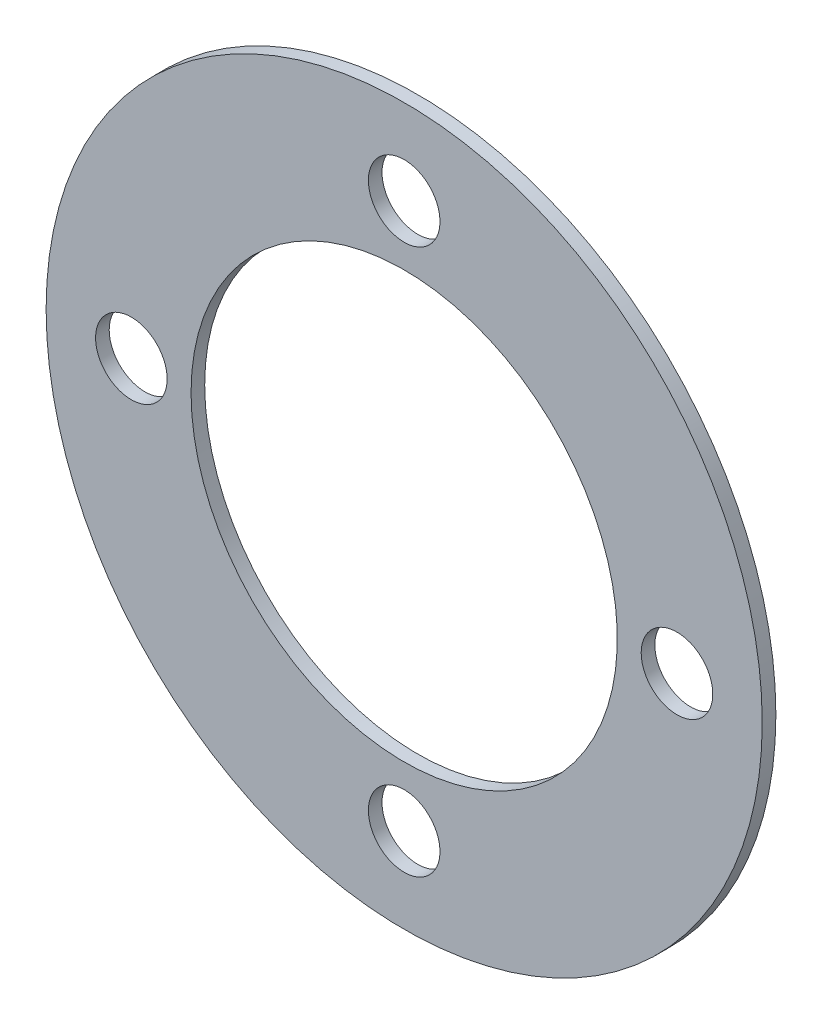
ISO-10303-21;
HEADER;
FILE_DESCRIPTION(('STEP AP214'),'2;1');
FILE_NAME('part.step','',(''),(''),'','','');
FILE_SCHEMA(('AUTOMOTIVE_DESIGN { 1 0 10303 214 1 1 1 1 }'));
ENDSEC;
DATA;
#1=APPLICATION_CONTEXT('core data for automotive mechanical design processes');
#2=APPLICATION_PROTOCOL_DEFINITION('international standard','automotive_design',2000,#1);
#3=PRODUCT_CONTEXT('',#1,'mechanical');
#4=PRODUCT('Part','Part','',(#3));
#5=PRODUCT_RELATED_PRODUCT_CATEGORY('part','',(#4));
#6=PRODUCT_DEFINITION_FORMATION('','',#4);
#7=PRODUCT_DEFINITION_CONTEXT('part definition',#1,'design');
#8=PRODUCT_DEFINITION('design','',#6,#7);
#9=PRODUCT_DEFINITION_SHAPE('','',#8);
#10=(LENGTH_UNIT() NAMED_UNIT(*) SI_UNIT(.MILLI.,.METRE.));
#11=(NAMED_UNIT(*) PLANE_ANGLE_UNIT() SI_UNIT($,.RADIAN.));
#12=(NAMED_UNIT(*) SI_UNIT($,.STERADIAN.) SOLID_ANGLE_UNIT());
#13=UNCERTAINTY_MEASURE_WITH_UNIT(LENGTH_MEASURE(1.E-05),#10,'distance_accuracy_value','');
#14=(GEOMETRIC_REPRESENTATION_CONTEXT(3) GLOBAL_UNCERTAINTY_ASSIGNED_CONTEXT((#13)) GLOBAL_UNIT_ASSIGNED_CONTEXT((#10,
#11,#12)) REPRESENTATION_CONTEXT('',''));
#15=CARTESIAN_POINT('',(0.,0.,0.));
#16=DIRECTION('',(0.,0.,1.));
#17=DIRECTION('',(1.,0.,0.));
#18=AXIS2_PLACEMENT_3D('',#15,#16,#17);
#19=CARTESIAN_POINT('',(0.,0.,0.));
#20=DIRECTION('',(0.,0.,1.));
#21=DIRECTION('',(1.,0.,0.));
#22=AXIS2_PLACEMENT_3D('',#19,#20,#21);
#23=PLANE('',#22);
#24=CARTESIAN_POINT('',(-16.,0.,0.));
#25=DIRECTION('',(0.,0.,-1.));
#26=DIRECTION('',(-1.,0.,0.));
#27=AXIS2_PLACEMENT_3D('',#24,#25,#26);
#28=CIRCLE('',#27,2.1);
#29=CARTESIAN_POINT('',(-18.1,0.,0.));
#30=VERTEX_POINT('',#29);
#31=EDGE_CURVE('E41',#30,#30,#28,.F.);
#32=ORIENTED_EDGE('',*,*,#31,.T.);
#33=EDGE_LOOP('',(#32));
#34=FACE_BOUND('',#33,.T.);
#35=CARTESIAN_POINT('',(16.,0.,0.));
#36=DIRECTION('',(0.,0.,-1.));
#37=DIRECTION('',(-1.,0.,0.));
#38=AXIS2_PLACEMENT_3D('',#35,#36,#37);
#39=CIRCLE('',#38,2.1);
#40=CARTESIAN_POINT('',(13.9,0.,0.));
#41=VERTEX_POINT('',#40);
#42=EDGE_CURVE('E44',#41,#41,#39,.F.);
#43=ORIENTED_EDGE('',*,*,#42,.T.);
#44=EDGE_LOOP('',(#43));
#45=FACE_BOUND('',#44,.T.);
#46=CARTESIAN_POINT('',(0.,0.,0.));
#47=DIRECTION('',(0.,0.,-1.));
#48=DIRECTION('',(-1.,0.,0.));
#49=AXIS2_PLACEMENT_3D('',#46,#47,#48);
#50=CIRCLE('',#49,12.5);
#51=CARTESIAN_POINT('',(-12.5,0.,0.));
#52=VERTEX_POINT('',#51);
#53=EDGE_CURVE('E47',#52,#52,#50,.F.);
#54=ORIENTED_EDGE('',*,*,#53,.T.);
#55=EDGE_LOOP('',(#54));
#56=FACE_BOUND('',#55,.T.);
#57=CARTESIAN_POINT('',(0.,0.,0.));
#58=DIRECTION('',(0.,0.,-1.));
#59=DIRECTION('',(-1.,0.,0.));
#60=AXIS2_PLACEMENT_3D('',#57,#58,#59);
#61=CIRCLE('',#60,21.);
#62=CARTESIAN_POINT('',(-21.,0.,0.));
#63=VERTEX_POINT('',#62);
#64=EDGE_CURVE('E50',#63,#63,#61,.F.);
#65=ORIENTED_EDGE('',*,*,#64,.F.);
#66=EDGE_LOOP('',(#65));
#67=FACE_BOUND('',#66,.T.);
#68=CARTESIAN_POINT('',(0.,16.,0.));
#69=DIRECTION('',(0.,0.,-1.));
#70=DIRECTION('',(-1.,0.,0.));
#71=AXIS2_PLACEMENT_3D('',#68,#69,#70);
#72=CIRCLE('',#71,2.1);
#73=CARTESIAN_POINT('',(-2.1,16.,0.));
#74=VERTEX_POINT('',#73);
#75=EDGE_CURVE('E52',#74,#74,#72,.F.);
#76=ORIENTED_EDGE('',*,*,#75,.T.);
#77=EDGE_LOOP('',(#76));
#78=FACE_BOUND('',#77,.T.);
#79=CARTESIAN_POINT('',(0.,-16.,0.));
#80=DIRECTION('',(0.,0.,-1.));
#81=DIRECTION('',(-1.,0.,0.));
#82=AXIS2_PLACEMENT_3D('',#79,#80,#81);
#83=CIRCLE('',#82,2.1);
#84=CARTESIAN_POINT('',(-2.1,-16.,0.));
#85=VERTEX_POINT('',#84);
#86=EDGE_CURVE('E18',#85,#85,#83,.F.);
#87=ORIENTED_EDGE('',*,*,#86,.T.);
#88=EDGE_LOOP('',(#87));
#89=FACE_BOUND('',#88,.T.);
#90=ADVANCED_FACE('F15',(#34,#45,#56,#67,#78,#89),#23,.F.);
#91=CARTESIAN_POINT('',(0.,-16.,0.8));
#92=DIRECTION('',(0.,0.,-1.));
#93=DIRECTION('',(-1.,0.,0.));
#94=AXIS2_PLACEMENT_3D('',#91,#92,#93);
#95=CYLINDRICAL_SURFACE('',#94,2.1);
#96=CARTESIAN_POINT('',(0.,-16.,0.8));
#97=DIRECTION('',(0.,0.,-1.));
#98=DIRECTION('',(-1.,0.,0.));
#99=AXIS2_PLACEMENT_3D('',#96,#97,#98);
#100=CIRCLE('',#99,2.1);
#101=CARTESIAN_POINT('',(-2.1,-16.,0.8));
#102=VERTEX_POINT('',#101);
#103=EDGE_CURVE('E38',#102,#102,#100,.T.);
#104=ORIENTED_EDGE('',*,*,#103,.F.);
#105=EDGE_LOOP('',(#104));
#106=FACE_BOUND('',#105,.T.);
#107=ORIENTED_EDGE('',*,*,#86,.F.);
#108=EDGE_LOOP('',(#107));
#109=FACE_BOUND('',#108,.T.);
#110=ADVANCED_FACE('F60',(#106,#109),#95,.F.);
#111=CARTESIAN_POINT('',(0.,16.,0.8));
#112=DIRECTION('',(0.,0.,-1.));
#113=DIRECTION('',(-1.,0.,0.));
#114=AXIS2_PLACEMENT_3D('',#111,#112,#113);
#115=CYLINDRICAL_SURFACE('',#114,2.1);
#116=CARTESIAN_POINT('',(0.,16.,0.8));
#117=DIRECTION('',(0.,0.,-1.));
#118=DIRECTION('',(-1.,0.,0.));
#119=AXIS2_PLACEMENT_3D('',#116,#117,#118);
#120=CIRCLE('',#119,2.1);
#121=CARTESIAN_POINT('',(-2.1,16.,0.8));
#122=VERTEX_POINT('',#121);
#123=EDGE_CURVE('E35',#122,#122,#120,.T.);
#124=ORIENTED_EDGE('',*,*,#123,.F.);
#125=EDGE_LOOP('',(#124));
#126=FACE_BOUND('',#125,.T.);
#127=ORIENTED_EDGE('',*,*,#75,.F.);
#128=EDGE_LOOP('',(#127));
#129=FACE_BOUND('',#128,.T.);
#130=ADVANCED_FACE('F62',(#126,#129),#115,.F.);
#131=CARTESIAN_POINT('',(0.,0.,0.8));
#132=DIRECTION('',(0.,0.,-1.));
#133=DIRECTION('',(-1.,0.,0.));
#134=AXIS2_PLACEMENT_3D('',#131,#132,#133);
#135=CYLINDRICAL_SURFACE('',#134,21.);
#136=ORIENTED_EDGE('',*,*,#64,.T.);
#137=EDGE_LOOP('',(#136));
#138=FACE_BOUND('',#137,.T.);
#139=CARTESIAN_POINT('',(0.,0.,0.8));
#140=DIRECTION('',(0.,0.,-1.));
#141=DIRECTION('',(-1.,0.,0.));
#142=AXIS2_PLACEMENT_3D('',#139,#140,#141);
#143=CIRCLE('',#142,21.);
#144=CARTESIAN_POINT('',(-21.,0.,0.8));
#145=VERTEX_POINT('',#144);
#146=EDGE_CURVE('E32',#145,#145,#143,.F.);
#147=ORIENTED_EDGE('',*,*,#146,.F.);
#148=EDGE_LOOP('',(#147));
#149=FACE_BOUND('',#148,.T.);
#150=ADVANCED_FACE('F69',(#138,#149),#135,.T.);
#151=CARTESIAN_POINT('',(0.,0.,0.8));
#152=DIRECTION('',(0.,0.,-1.));
#153=DIRECTION('',(-1.,0.,0.));
#154=AXIS2_PLACEMENT_3D('',#151,#152,#153);
#155=CYLINDRICAL_SURFACE('',#154,12.5);
#156=CARTESIAN_POINT('',(0.,0.,0.8));
#157=DIRECTION('',(0.,0.,-1.));
#158=DIRECTION('',(-1.,0.,0.));
#159=AXIS2_PLACEMENT_3D('',#156,#157,#158);
#160=CIRCLE('',#159,12.5);
#161=CARTESIAN_POINT('',(-12.5,0.,0.8));
#162=VERTEX_POINT('',#161);
#163=EDGE_CURVE('E27',#162,#162,#160,.T.);
#164=ORIENTED_EDGE('',*,*,#163,.F.);
#165=EDGE_LOOP('',(#164));
#166=FACE_BOUND('',#165,.T.);
#167=ORIENTED_EDGE('',*,*,#53,.F.);
#168=EDGE_LOOP('',(#167));
#169=FACE_BOUND('',#168,.T.);
#170=ADVANCED_FACE('F88',(#166,#169),#155,.F.);
#171=CARTESIAN_POINT('',(16.,0.,0.8));
#172=DIRECTION('',(0.,0.,-1.));
#173=DIRECTION('',(-1.,0.,0.));
#174=AXIS2_PLACEMENT_3D('',#171,#172,#173);
#175=CYLINDRICAL_SURFACE('',#174,2.1);
#176=CARTESIAN_POINT('',(16.,0.,0.8));
#177=DIRECTION('',(0.,0.,-1.));
#178=DIRECTION('',(-1.,0.,0.));
#179=AXIS2_PLACEMENT_3D('',#176,#177,#178);
#180=CIRCLE('',#179,2.1);
#181=CARTESIAN_POINT('',(13.9,0.,0.8));
#182=VERTEX_POINT('',#181);
#183=EDGE_CURVE('E22',#182,#182,#180,.T.);
#184=ORIENTED_EDGE('',*,*,#183,.F.);
#185=EDGE_LOOP('',(#184));
#186=FACE_BOUND('',#185,.T.);
#187=ORIENTED_EDGE('',*,*,#42,.F.);
#188=EDGE_LOOP('',(#187));
#189=FACE_BOUND('',#188,.T.);
#190=ADVANCED_FACE('F81',(#186,#189),#175,.F.);
#191=CARTESIAN_POINT('',(-16.,0.,0.8));
#192=DIRECTION('',(0.,0.,-1.));
#193=DIRECTION('',(-1.,0.,0.));
#194=AXIS2_PLACEMENT_3D('',#191,#192,#193);
#195=CYLINDRICAL_SURFACE('',#194,2.1);
#196=CARTESIAN_POINT('',(-16.,0.,0.8));
#197=DIRECTION('',(0.,0.,-1.));
#198=DIRECTION('',(-1.,0.,0.));
#199=AXIS2_PLACEMENT_3D('',#196,#197,#198);
#200=CIRCLE('',#199,2.1);
#201=CARTESIAN_POINT('',(-18.1,0.,0.8));
#202=VERTEX_POINT('',#201);
#203=EDGE_CURVE('E9',#202,#202,#200,.T.);
#204=ORIENTED_EDGE('',*,*,#203,.F.);
#205=EDGE_LOOP('',(#204));
#206=FACE_BOUND('',#205,.T.);
#207=ORIENTED_EDGE('',*,*,#31,.F.);
#208=EDGE_LOOP('',(#207));
#209=FACE_BOUND('',#208,.T.);
#210=ADVANCED_FACE('F76',(#206,#209),#195,.F.);
#211=CARTESIAN_POINT('',(0.,0.,0.8));
#212=DIRECTION('',(0.,0.,1.));
#213=DIRECTION('',(1.,0.,0.));
#214=AXIS2_PLACEMENT_3D('',#211,#212,#213);
#215=PLANE('',#214);
#216=ORIENTED_EDGE('',*,*,#203,.T.);
#217=EDGE_LOOP('',(#216));
#218=FACE_BOUND('',#217,.T.);
#219=ORIENTED_EDGE('',*,*,#183,.T.);
#220=EDGE_LOOP('',(#219));
#221=FACE_BOUND('',#220,.T.);
#222=ORIENTED_EDGE('',*,*,#163,.T.);
#223=EDGE_LOOP('',(#222));
#224=FACE_BOUND('',#223,.T.);
#225=ORIENTED_EDGE('',*,*,#146,.T.);
#226=EDGE_LOOP('',(#225));
#227=FACE_BOUND('',#226,.T.);
#228=ORIENTED_EDGE('',*,*,#123,.T.);
#229=EDGE_LOOP('',(#228));
#230=FACE_BOUND('',#229,.T.);
#231=ORIENTED_EDGE('',*,*,#103,.T.);
#232=EDGE_LOOP('',(#231));
#233=FACE_BOUND('',#232,.T.);
#234=ADVANCED_FACE('F74',(#218,#221,#224,#227,#230,#233),#215,.T.);
#235=CLOSED_SHELL('',(#90,#110,#130,#150,#170,#190,#210,#234));
#236=MANIFOLD_SOLID_BREP('B1',#235);
#237=ADVANCED_BREP_SHAPE_REPRESENTATION('',(#18,#236),#14);
#238=SHAPE_DEFINITION_REPRESENTATION(#9,#237);
ENDSEC;
END-ISO-10303-21;
